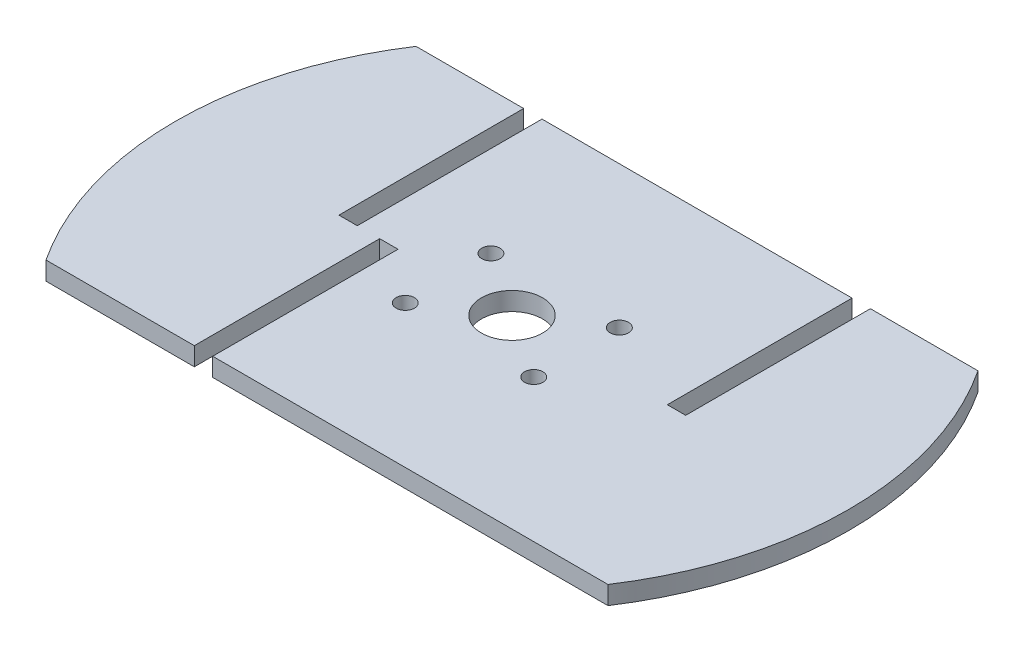
ISO-10303-21;
HEADER;
FILE_DESCRIPTION(('STEP AP214'),'2;1');
FILE_NAME('part.step','',(''),(''),'','','');
FILE_SCHEMA(('AUTOMOTIVE_DESIGN { 1 0 10303 214 1 1 1 1 }'));
ENDSEC;
DATA;
#1=APPLICATION_CONTEXT('core data for automotive mechanical design processes');
#2=APPLICATION_PROTOCOL_DEFINITION('international standard','automotive_design',2000,#1);
#3=PRODUCT_CONTEXT('',#1,'mechanical');
#4=PRODUCT('Part','Part','',(#3));
#5=PRODUCT_RELATED_PRODUCT_CATEGORY('part','',(#4));
#6=PRODUCT_DEFINITION_FORMATION('','',#4);
#7=PRODUCT_DEFINITION_CONTEXT('part definition',#1,'design');
#8=PRODUCT_DEFINITION('design','',#6,#7);
#9=PRODUCT_DEFINITION_SHAPE('','',#8);
#10=(LENGTH_UNIT() NAMED_UNIT(*) SI_UNIT(.MILLI.,.METRE.));
#11=(NAMED_UNIT(*) PLANE_ANGLE_UNIT() SI_UNIT($,.RADIAN.));
#12=(NAMED_UNIT(*) SI_UNIT($,.STERADIAN.) SOLID_ANGLE_UNIT());
#13=UNCERTAINTY_MEASURE_WITH_UNIT(LENGTH_MEASURE(1.E-05),#10,'distance_accuracy_value','');
#14=(GEOMETRIC_REPRESENTATION_CONTEXT(3) GLOBAL_UNCERTAINTY_ASSIGNED_CONTEXT((#13)) GLOBAL_UNIT_ASSIGNED_CONTEXT((#10,
#11,#12)) REPRESENTATION_CONTEXT('',''));
#15=CARTESIAN_POINT('',(0.,0.,0.));
#16=DIRECTION('',(0.,0.,1.));
#17=DIRECTION('',(1.,0.,0.));
#18=AXIS2_PLACEMENT_3D('',#15,#16,#17);
#19=CARTESIAN_POINT('',(54.57763981957,3.,56.7970057737135));
#20=DIRECTION('',(0.,0.,1.));
#21=DIRECTION('',(1.,0.,0.));
#22=AXIS2_PLACEMENT_3D('',#19,#20,#21);
#23=PLANE('',#22);
#24=DIRECTION('',(0.,1.,0.));
#25=VECTOR('',#24,1.);
#26=CARTESIAN_POINT('',(-15.45236018043,0.,56.7970057737135));
#27=LINE('',#26,#25);
#28=CARTESIAN_POINT('',(-15.45236018043,0.,56.7970057737135));
#29=VERTEX_POINT('',#28);
#30=CARTESIAN_POINT('',(-15.45236018043,3.,56.7970057737135));
#31=VERTEX_POINT('',#30);
#32=EDGE_CURVE('E345',#29,#31,#27,.T.);
#33=ORIENTED_EDGE('',*,*,#32,.T.);
#34=DIRECTION('',(-1.,0.,0.));
#35=VECTOR('',#34,1.);
#36=CARTESIAN_POINT('',(54.57763981957,3.,56.7970057737135));
#37=LINE('',#36,#35);
#38=CARTESIAN_POINT('',(-39.7014161737776,3.,56.7970057737135));
#39=VERTEX_POINT('',#38);
#40=EDGE_CURVE('E230',#31,#39,#37,.T.);
#41=ORIENTED_EDGE('',*,*,#40,.T.);
#42=DIRECTION('',(0.,1.,0.));
#43=VECTOR('',#42,1.);
#44=CARTESIAN_POINT('',(-39.7014161737776,0.,56.7970057737135));
#45=LINE('',#44,#43);
#46=CARTESIAN_POINT('',(-39.7014161737776,0.,56.7970057737135));
#47=VERTEX_POINT('',#46);
#48=EDGE_CURVE('E331',#47,#39,#45,.T.);
#49=ORIENTED_EDGE('',*,*,#48,.F.);
#50=DIRECTION('',(-1.,0.,0.));
#51=VECTOR('',#50,1.);
#52=CARTESIAN_POINT('',(54.57763981957,0.,56.7970057737135));
#53=LINE('',#52,#51);
#54=EDGE_CURVE('E190',#29,#47,#53,.T.);
#55=ORIENTED_EDGE('',*,*,#54,.F.);
#56=EDGE_LOOP('',(#33,#41,#49,#55));
#57=FACE_BOUND('',#56,.T.);
#58=ADVANCED_FACE('F45',(#57),#23,.T.);
#59=DIRECTION('',(0.,1.,0.));
#60=VECTOR('',#59,1.);
#61=CARTESIAN_POINT('',(-12.45236018043,0.,56.7970057737135));
#62=LINE('',#61,#60);
#63=CARTESIAN_POINT('',(-12.45236018043,0.,56.7970057737135));
#64=VERTEX_POINT('',#63);
#65=CARTESIAN_POINT('',(-12.45236018043,3.,56.7970057737135));
#66=VERTEX_POINT('',#65);
#67=EDGE_CURVE('E164',#64,#66,#62,.T.);
#68=ORIENTED_EDGE('',*,*,#67,.F.);
#69=CARTESIAN_POINT('',(52.1666958129177,0.,56.7970057737135));
#70=VERTEX_POINT('',#69);
#71=EDGE_CURVE('E176',#70,#64,#53,.T.);
#72=ORIENTED_EDGE('',*,*,#71,.F.);
#73=DIRECTION('',(0.,1.,0.));
#74=VECTOR('',#73,1.);
#75=CARTESIAN_POINT('',(52.1666958129177,0.,56.7970057737135));
#76=LINE('',#75,#74);
#77=CARTESIAN_POINT('',(52.1666958129177,3.,56.7970057737135));
#78=VERTEX_POINT('',#77);
#79=EDGE_CURVE('E338',#70,#78,#76,.T.);
#80=ORIENTED_EDGE('',*,*,#79,.T.);
#81=EDGE_CURVE('E178',#78,#66,#37,.T.);
#82=ORIENTED_EDGE('',*,*,#81,.T.);
#83=EDGE_LOOP('',(#68,#72,#80,#82));
#84=FACE_BOUND('',#83,.T.);
#85=ADVANCED_FACE('F47',(#84),#23,.T.);
#86=CARTESIAN_POINT('',(34.57763981957,3.,-3.70299422628653));
#87=DIRECTION('',(0.,0.,-1.));
#88=DIRECTION('',(-1.,0.,0.));
#89=AXIS2_PLACEMENT_3D('',#86,#87,#88);
#90=PLANE('',#89);
#91=DIRECTION('',(0.,1.,0.));
#92=VECTOR('',#91,1.);
#93=CARTESIAN_POINT('',(52.1666958129177,0.,-3.70299422628653));
#94=LINE('',#93,#92);
#95=CARTESIAN_POINT('',(52.1666958129177,0.,-3.70299422628653));
#96=VERTEX_POINT('',#95);
#97=CARTESIAN_POINT('',(52.1666958129177,3.,-3.70299422628653));
#98=VERTEX_POINT('',#97);
#99=EDGE_CURVE('E342',#96,#98,#94,.T.);
#100=ORIENTED_EDGE('',*,*,#99,.F.);
#101=DIRECTION('',(1.,0.,0.));
#102=VECTOR('',#101,1.);
#103=CARTESIAN_POINT('',(34.57763981957,0.,-3.70299422628653));
#104=LINE('',#103,#102);
#105=CARTESIAN_POINT('',(34.57763981957,0.,-3.70299422628653));
#106=VERTEX_POINT('',#105);
#107=EDGE_CURVE('E228',#106,#96,#104,.T.);
#108=ORIENTED_EDGE('',*,*,#107,.F.);
#109=DIRECTION('',(0.,-1.,0.));
#110=VECTOR('',#109,1.);
#111=CARTESIAN_POINT('',(34.57763981957,3.,-3.70299422628653));
#112=LINE('',#111,#110);
#113=CARTESIAN_POINT('',(34.57763981957,3.,-3.70299422628653));
#114=VERTEX_POINT('',#113);
#115=EDGE_CURVE('E11',#114,#106,#112,.T.);
#116=ORIENTED_EDGE('',*,*,#115,.F.);
#117=DIRECTION('',(1.,0.,0.));
#118=VECTOR('',#117,1.);
#119=CARTESIAN_POINT('',(34.57763981957,3.,-3.70299422628653));
#120=LINE('',#119,#118);
#121=EDGE_CURVE('E198',#114,#98,#120,.T.);
#122=ORIENTED_EDGE('',*,*,#121,.T.);
#123=EDGE_LOOP('',(#100,#108,#116,#122));
#124=FACE_BOUND('',#123,.T.);
#125=ADVANCED_FACE('F415',(#124),#90,.T.);
#126=CARTESIAN_POINT('',(34.57763981957,3.,26.4970057737135));
#127=DIRECTION('',(-1.,0.,0.));
#128=DIRECTION('',(0.,0.,1.));
#129=AXIS2_PLACEMENT_3D('',#126,#127,#128);
#130=PLANE('',#129);
#131=DIRECTION('',(0.,0.,-1.));
#132=VECTOR('',#131,1.);
#133=CARTESIAN_POINT('',(34.57763981957,0.,26.4970057737135));
#134=LINE('',#133,#132);
#135=CARTESIAN_POINT('',(34.57763981957,0.,26.4970057737135));
#136=VERTEX_POINT('',#135);
#137=EDGE_CURVE('E224',#136,#106,#134,.T.);
#138=ORIENTED_EDGE('',*,*,#137,.F.);
#139=DIRECTION('',(0.,-1.,0.));
#140=VECTOR('',#139,1.);
#141=CARTESIAN_POINT('',(34.57763981957,3.,26.4970057737135));
#142=LINE('',#141,#140);
#143=CARTESIAN_POINT('',(34.57763981957,3.,26.4970057737135));
#144=VERTEX_POINT('',#143);
#145=EDGE_CURVE('E55',#144,#136,#142,.T.);
#146=ORIENTED_EDGE('',*,*,#145,.F.);
#147=DIRECTION('',(0.,0.,-1.));
#148=VECTOR('',#147,1.);
#149=CARTESIAN_POINT('',(34.57763981957,3.,26.4970057737135));
#150=LINE('',#149,#148);
#151=EDGE_CURVE('E259',#144,#114,#150,.T.);
#152=ORIENTED_EDGE('',*,*,#151,.T.);
#153=ORIENTED_EDGE('',*,*,#115,.T.);
#154=EDGE_LOOP('',(#138,#146,#152,#153));
#155=FACE_BOUND('',#154,.T.);
#156=ADVANCED_FACE('F413',(#155),#130,.T.);
#157=CARTESIAN_POINT('',(31.57763981957,3.,26.4970057737135));
#158=DIRECTION('',(0.,0.,-1.));
#159=DIRECTION('',(-1.,0.,0.));
#160=AXIS2_PLACEMENT_3D('',#157,#158,#159);
#161=PLANE('',#160);
#162=DIRECTION('',(1.,0.,0.));
#163=VECTOR('',#162,1.);
#164=CARTESIAN_POINT('',(31.57763981957,0.,26.4970057737135));
#165=LINE('',#164,#163);
#166=CARTESIAN_POINT('',(31.57763981957,0.,26.4970057737135));
#167=VERTEX_POINT('',#166);
#168=EDGE_CURVE('E220',#167,#136,#165,.T.);
#169=ORIENTED_EDGE('',*,*,#168,.F.);
#170=DIRECTION('',(0.,-1.,0.));
#171=VECTOR('',#170,1.);
#172=CARTESIAN_POINT('',(31.57763981957,3.,26.4970057737135));
#173=LINE('',#172,#171);
#174=CARTESIAN_POINT('',(31.57763981957,3.,26.4970057737135));
#175=VERTEX_POINT('',#174);
#176=EDGE_CURVE('E234',#175,#167,#173,.T.);
#177=ORIENTED_EDGE('',*,*,#176,.F.);
#178=DIRECTION('',(1.,0.,0.));
#179=VECTOR('',#178,1.);
#180=CARTESIAN_POINT('',(31.57763981957,3.,26.4970057737135));
#181=LINE('',#180,#179);
#182=EDGE_CURVE('E265',#175,#144,#181,.T.);
#183=ORIENTED_EDGE('',*,*,#182,.T.);
#184=ORIENTED_EDGE('',*,*,#145,.T.);
#185=EDGE_LOOP('',(#169,#177,#183,#184));
#186=FACE_BOUND('',#185,.T.);
#187=ADVANCED_FACE('F412',(#186),#161,.T.);
#188=CARTESIAN_POINT('',(31.57763981957,3.,-3.70299422628653));
#189=DIRECTION('',(1.,0.,0.));
#190=DIRECTION('',(0.,0.,-1.));
#191=AXIS2_PLACEMENT_3D('',#188,#189,#190);
#192=PLANE('',#191);
#193=DIRECTION('',(0.,0.,1.));
#194=VECTOR('',#193,1.);
#195=CARTESIAN_POINT('',(31.57763981957,0.,-3.70299422628653));
#196=LINE('',#195,#194);
#197=CARTESIAN_POINT('',(31.57763981957,0.,-3.70299422628653));
#198=VERTEX_POINT('',#197);
#199=EDGE_CURVE('E216',#198,#167,#196,.T.);
#200=ORIENTED_EDGE('',*,*,#199,.F.);
#201=DIRECTION('',(0.,-1.,0.));
#202=VECTOR('',#201,1.);
#203=CARTESIAN_POINT('',(31.57763981957,3.,-3.70299422628653));
#204=LINE('',#203,#202);
#205=CARTESIAN_POINT('',(31.57763981957,3.,-3.70299422628653));
#206=VERTEX_POINT('',#205);
#207=EDGE_CURVE('E237',#206,#198,#204,.T.);
#208=ORIENTED_EDGE('',*,*,#207,.F.);
#209=DIRECTION('',(0.,0.,1.));
#210=VECTOR('',#209,1.);
#211=CARTESIAN_POINT('',(31.57763981957,3.,-3.70299422628653));
#212=LINE('',#211,#210);
#213=EDGE_CURVE('E270',#206,#175,#212,.T.);
#214=ORIENTED_EDGE('',*,*,#213,.T.);
#215=ORIENTED_EDGE('',*,*,#176,.T.);
#216=EDGE_LOOP('',(#200,#208,#214,#215));
#217=FACE_BOUND('',#216,.T.);
#218=ADVANCED_FACE('F408',(#217),#192,.T.);
#219=CARTESIAN_POINT('',(-12.45236018043,3.,-3.70299422628653));
#220=DIRECTION('',(0.,0.,-1.));
#221=DIRECTION('',(-1.,0.,0.));
#222=AXIS2_PLACEMENT_3D('',#219,#220,#221);
#223=PLANE('',#222);
#224=DIRECTION('',(1.,0.,0.));
#225=VECTOR('',#224,1.);
#226=CARTESIAN_POINT('',(-12.45236018043,0.,-3.70299422628653));
#227=LINE('',#226,#225);
#228=CARTESIAN_POINT('',(-19.11236018043,0.,-3.70299422628653));
#229=VERTEX_POINT('',#228);
#230=EDGE_CURVE('E212',#229,#198,#227,.T.);
#231=ORIENTED_EDGE('',*,*,#230,.F.);
#232=DIRECTION('',(0.,-1.,0.));
#233=VECTOR('',#232,1.);
#234=CARTESIAN_POINT('',(-19.11236018043,3.,-3.70299422628653));
#235=LINE('',#234,#233);
#236=CARTESIAN_POINT('',(-19.11236018043,3.,-3.70299422628653));
#237=VERTEX_POINT('',#236);
#238=EDGE_CURVE('E240',#237,#229,#235,.T.);
#239=ORIENTED_EDGE('',*,*,#238,.F.);
#240=DIRECTION('',(1.,0.,0.));
#241=VECTOR('',#240,1.);
#242=CARTESIAN_POINT('',(-19.11236018043,3.,-3.70299422628653));
#243=LINE('',#242,#241);
#244=EDGE_CURVE('E276',#237,#206,#243,.T.);
#245=ORIENTED_EDGE('',*,*,#244,.T.);
#246=ORIENTED_EDGE('',*,*,#207,.T.);
#247=EDGE_LOOP('',(#231,#239,#245,#246));
#248=FACE_BOUND('',#247,.T.);
#249=ADVANCED_FACE('F402',(#248),#223,.T.);
#250=CARTESIAN_POINT('',(-19.11236018043,3.,26.4970057737135));
#251=DIRECTION('',(-1.,0.,0.));
#252=DIRECTION('',(0.,0.,1.));
#253=AXIS2_PLACEMENT_3D('',#250,#251,#252);
#254=PLANE('',#253);
#255=DIRECTION('',(0.,0.,-1.));
#256=VECTOR('',#255,1.);
#257=CARTESIAN_POINT('',(-19.11236018043,0.,26.4970057737135));
#258=LINE('',#257,#256);
#259=CARTESIAN_POINT('',(-19.11236018043,0.,26.4970057737135));
#260=VERTEX_POINT('',#259);
#261=EDGE_CURVE('E208',#260,#229,#258,.T.);
#262=ORIENTED_EDGE('',*,*,#261,.F.);
#263=DIRECTION('',(0.,-1.,0.));
#264=VECTOR('',#263,1.);
#265=CARTESIAN_POINT('',(-19.11236018043,3.,26.4970057737135));
#266=LINE('',#265,#264);
#267=CARTESIAN_POINT('',(-19.11236018043,3.,26.4970057737135));
#268=VERTEX_POINT('',#267);
#269=EDGE_CURVE('E244',#268,#260,#266,.T.);
#270=ORIENTED_EDGE('',*,*,#269,.F.);
#271=DIRECTION('',(0.,0.,-1.));
#272=VECTOR('',#271,1.);
#273=CARTESIAN_POINT('',(-19.11236018043,3.,26.4970057737135));
#274=LINE('',#273,#272);
#275=EDGE_CURVE('E279',#268,#237,#274,.T.);
#276=ORIENTED_EDGE('',*,*,#275,.T.);
#277=ORIENTED_EDGE('',*,*,#238,.T.);
#278=EDGE_LOOP('',(#262,#270,#276,#277));
#279=FACE_BOUND('',#278,.T.);
#280=ADVANCED_FACE('F399',(#279),#254,.T.);
#281=CARTESIAN_POINT('',(-22.11236018043,3.,26.4970057737135));
#282=DIRECTION('',(0.,0.,-1.));
#283=DIRECTION('',(-1.,0.,0.));
#284=AXIS2_PLACEMENT_3D('',#281,#282,#283);
#285=PLANE('',#284);
#286=DIRECTION('',(1.,0.,0.));
#287=VECTOR('',#286,1.);
#288=CARTESIAN_POINT('',(-22.11236018043,0.,26.4970057737135));
#289=LINE('',#288,#287);
#290=CARTESIAN_POINT('',(-22.11236018043,0.,26.4970057737135));
#291=VERTEX_POINT('',#290);
#292=EDGE_CURVE('E204',#291,#260,#289,.T.);
#293=ORIENTED_EDGE('',*,*,#292,.F.);
#294=DIRECTION('',(0.,-1.,0.));
#295=VECTOR('',#294,1.);
#296=CARTESIAN_POINT('',(-22.11236018043,3.,26.4970057737135));
#297=LINE('',#296,#295);
#298=CARTESIAN_POINT('',(-22.11236018043,3.,26.4970057737135));
#299=VERTEX_POINT('',#298);
#300=EDGE_CURVE('E246',#299,#291,#297,.T.);
#301=ORIENTED_EDGE('',*,*,#300,.F.);
#302=DIRECTION('',(1.,0.,0.));
#303=VECTOR('',#302,1.);
#304=CARTESIAN_POINT('',(-22.11236018043,3.,26.4970057737135));
#305=LINE('',#304,#303);
#306=EDGE_CURVE('E283',#299,#268,#305,.T.);
#307=ORIENTED_EDGE('',*,*,#306,.T.);
#308=ORIENTED_EDGE('',*,*,#269,.T.);
#309=EDGE_LOOP('',(#293,#301,#307,#308));
#310=FACE_BOUND('',#309,.T.);
#311=ADVANCED_FACE('F396',(#310),#285,.T.);
#312=CARTESIAN_POINT('',(-22.11236018043,3.,-3.70299422628653));
#313=DIRECTION('',(1.,0.,0.));
#314=DIRECTION('',(0.,0.,-1.));
#315=AXIS2_PLACEMENT_3D('',#312,#313,#314);
#316=PLANE('',#315);
#317=DIRECTION('',(0.,0.,1.));
#318=VECTOR('',#317,1.);
#319=CARTESIAN_POINT('',(-22.11236018043,0.,-3.70299422628653));
#320=LINE('',#319,#318);
#321=CARTESIAN_POINT('',(-22.11236018043,0.,-3.70299422628653));
#322=VERTEX_POINT('',#321);
#323=EDGE_CURVE('E194',#322,#291,#320,.T.);
#324=ORIENTED_EDGE('',*,*,#323,.F.);
#325=DIRECTION('',(0.,-1.,0.));
#326=VECTOR('',#325,1.);
#327=CARTESIAN_POINT('',(-22.11236018043,3.,-3.70299422628653));
#328=LINE('',#327,#326);
#329=CARTESIAN_POINT('',(-22.11236018043,3.,-3.70299422628653));
#330=VERTEX_POINT('',#329);
#331=EDGE_CURVE('E49',#330,#322,#328,.T.);
#332=ORIENTED_EDGE('',*,*,#331,.F.);
#333=DIRECTION('',(0.,0.,1.));
#334=VECTOR('',#333,1.);
#335=CARTESIAN_POINT('',(-22.11236018043,3.,-3.70299422628653));
#336=LINE('',#335,#334);
#337=EDGE_CURVE('E287',#330,#299,#336,.T.);
#338=ORIENTED_EDGE('',*,*,#337,.T.);
#339=ORIENTED_EDGE('',*,*,#300,.T.);
#340=EDGE_LOOP('',(#324,#332,#338,#339));
#341=FACE_BOUND('',#340,.T.);
#342=ADVANCED_FACE('F393',(#341),#316,.T.);
#343=CARTESIAN_POINT('',(-42.11236018043,3.,-3.70299422628653));
#344=DIRECTION('',(0.,0.,-1.));
#345=DIRECTION('',(-1.,0.,0.));
#346=AXIS2_PLACEMENT_3D('',#343,#344,#345);
#347=PLANE('',#346);
#348=DIRECTION('',(0.,1.,0.));
#349=VECTOR('',#348,1.);
#350=CARTESIAN_POINT('',(-39.7014161737776,0.,-3.70299422628653));
#351=LINE('',#350,#349);
#352=CARTESIAN_POINT('',(-39.7014161737776,0.,-3.70299422628653));
#353=VERTEX_POINT('',#352);
#354=CARTESIAN_POINT('',(-39.7014161737776,3.,-3.70299422628653));
#355=VERTEX_POINT('',#354);
#356=EDGE_CURVE('E71',#353,#355,#351,.T.);
#357=ORIENTED_EDGE('',*,*,#356,.T.);
#358=DIRECTION('',(1.,0.,0.));
#359=VECTOR('',#358,1.);
#360=CARTESIAN_POINT('',(-42.11236018043,3.,-3.70299422628653));
#361=LINE('',#360,#359);
#362=EDGE_CURVE('E290',#355,#330,#361,.T.);
#363=ORIENTED_EDGE('',*,*,#362,.T.);
#364=ORIENTED_EDGE('',*,*,#331,.T.);
#365=DIRECTION('',(1.,0.,0.));
#366=VECTOR('',#365,1.);
#367=CARTESIAN_POINT('',(-42.11236018043,0.,-3.70299422628653));
#368=LINE('',#367,#366);
#369=EDGE_CURVE('E189',#353,#322,#368,.T.);
#370=ORIENTED_EDGE('',*,*,#369,.F.);
#371=EDGE_LOOP('',(#357,#363,#364,#370));
#372=FACE_BOUND('',#371,.T.);
#373=ADVANCED_FACE('F392',(#372),#347,.T.);
#374=CARTESIAN_POINT('',(-42.11236018043,3.,46.7970057737135));
#375=DIRECTION('',(0.,-1.,0.));
#376=DIRECTION('',(0.,0.,-1.));
#377=AXIS2_PLACEMENT_3D('',#374,#375,#376);
#378=PLANE('',#377);
#379=CARTESIAN_POINT('',(-4.26736018042996,3.,33.4970057737135));
#380=DIRECTION('',(0.,1.,0.));
#381=DIRECTION('',(0.,0.,1.));
#382=AXIS2_PLACEMENT_3D('',#379,#380,#381);
#383=CIRCLE('',#382,1.5);
#384=CARTESIAN_POINT('',(-4.26736018042996,3.,34.9970057737135));
#385=VERTEX_POINT('',#384);
#386=EDGE_CURVE('E307',#385,#385,#383,.T.);
#387=ORIENTED_EDGE('',*,*,#386,.F.);
#388=EDGE_LOOP('',(#387));
#389=FACE_BOUND('',#388,.T.);
#390=CARTESIAN_POINT('',(16.73263981957,3.,19.4970057737135));
#391=DIRECTION('',(0.,1.,0.));
#392=DIRECTION('',(0.,0.,1.));
#393=AXIS2_PLACEMENT_3D('',#390,#391,#392);
#394=CIRCLE('',#393,1.5);
#395=CARTESIAN_POINT('',(16.73263981957,3.,20.9970057737135));
#396=VERTEX_POINT('',#395);
#397=EDGE_CURVE('E315',#396,#396,#394,.T.);
#398=ORIENTED_EDGE('',*,*,#397,.F.);
#399=EDGE_LOOP('',(#398));
#400=FACE_BOUND('',#399,.T.);
#401=CARTESIAN_POINT('',(16.73263981957,3.,33.4970057737135));
#402=DIRECTION('',(0.,1.,0.));
#403=DIRECTION('',(0.,0.,1.));
#404=AXIS2_PLACEMENT_3D('',#401,#402,#403);
#405=CIRCLE('',#404,1.5);
#406=CARTESIAN_POINT('',(16.73263981957,3.,34.9970057737135));
#407=VERTEX_POINT('',#406);
#408=EDGE_CURVE('E316',#407,#407,#405,.T.);
#409=ORIENTED_EDGE('',*,*,#408,.F.);
#410=EDGE_LOOP('',(#409));
#411=FACE_BOUND('',#410,.T.);
#412=CARTESIAN_POINT('',(-4.26736018042996,3.,19.4970057737135));
#413=DIRECTION('',(0.,1.,0.));
#414=DIRECTION('',(0.,0.,1.));
#415=AXIS2_PLACEMENT_3D('',#412,#413,#414);
#416=CIRCLE('',#415,1.5);
#417=CARTESIAN_POINT('',(-4.26736018042996,3.,20.9970057737135));
#418=VERTEX_POINT('',#417);
#419=EDGE_CURVE('E303',#418,#418,#416,.T.);
#420=ORIENTED_EDGE('',*,*,#419,.F.);
#421=EDGE_LOOP('',(#420));
#422=FACE_BOUND('',#421,.T.);
#423=CARTESIAN_POINT('',(6.23263981957004,3.,26.5470057737135));
#424=DIRECTION('',(0.,1.,0.));
#425=DIRECTION('',(0.,0.,1.));
#426=AXIS2_PLACEMENT_3D('',#423,#424,#425);
#427=CIRCLE('',#426,5.);
#428=CARTESIAN_POINT('',(6.23263981957004,3.,31.5470057737135));
#429=VERTEX_POINT('',#428);
#430=EDGE_CURVE('E295',#429,#429,#427,.T.);
#431=ORIENTED_EDGE('',*,*,#430,.F.);
#432=EDGE_LOOP('',(#431));
#433=FACE_BOUND('',#432,.T.);
#434=ORIENTED_EDGE('',*,*,#40,.F.);
#435=DIRECTION('',(0.,0.,1.));
#436=VECTOR('',#435,1.);
#437=CARTESIAN_POINT('',(-15.45236018043,3.,56.7970057737135));
#438=LINE('',#437,#436);
#439=CARTESIAN_POINT('',(-15.45236018043,3.,26.4970057737135));
#440=VERTEX_POINT('',#439);
#441=EDGE_CURVE('E170',#440,#31,#438,.T.);
#442=ORIENTED_EDGE('',*,*,#441,.F.);
#443=DIRECTION('',(-1.,0.,0.));
#444=VECTOR('',#443,1.);
#445=CARTESIAN_POINT('',(-15.45236018043,3.,26.4970057737135));
#446=LINE('',#445,#444);
#447=CARTESIAN_POINT('',(-12.45236018043,3.,26.4970057737135));
#448=VERTEX_POINT('',#447);
#449=EDGE_CURVE('E368',#448,#440,#446,.T.);
#450=ORIENTED_EDGE('',*,*,#449,.F.);
#451=DIRECTION('',(0.,0.,-1.));
#452=VECTOR('',#451,1.);
#453=CARTESIAN_POINT('',(-12.45236018043,3.,26.4970057737135));
#454=LINE('',#453,#452);
#455=EDGE_CURVE('E372',#66,#448,#454,.T.);
#456=ORIENTED_EDGE('',*,*,#455,.F.);
#457=ORIENTED_EDGE('',*,*,#81,.F.);
#458=CARTESIAN_POINT('',(6.23263981957004,3.,26.5470057737135));
#459=DIRECTION('',(0.,-1.,0.));
#460=DIRECTION('',(0.,0.,-1.));
#461=AXIS2_PLACEMENT_3D('',#458,#459,#460);
#462=CIRCLE('',#461,55.);
#463=EDGE_CURVE('E337',#98,#78,#462,.T.);
#464=ORIENTED_EDGE('',*,*,#463,.F.);
#465=ORIENTED_EDGE('',*,*,#121,.F.);
#466=ORIENTED_EDGE('',*,*,#151,.F.);
#467=ORIENTED_EDGE('',*,*,#182,.F.);
#468=ORIENTED_EDGE('',*,*,#213,.F.);
#469=ORIENTED_EDGE('',*,*,#244,.F.);
#470=ORIENTED_EDGE('',*,*,#275,.F.);
#471=ORIENTED_EDGE('',*,*,#306,.F.);
#472=ORIENTED_EDGE('',*,*,#337,.F.);
#473=ORIENTED_EDGE('',*,*,#362,.F.);
#474=CARTESIAN_POINT('',(6.23263981957004,3.,26.5470057737135));
#475=DIRECTION('',(0.,-1.,0.));
#476=DIRECTION('',(0.,0.,-1.));
#477=AXIS2_PLACEMENT_3D('',#474,#475,#476);
#478=CIRCLE('',#477,55.);
#479=EDGE_CURVE('E341',#39,#355,#478,.T.);
#480=ORIENTED_EDGE('',*,*,#479,.F.);
#481=EDGE_LOOP('',(#434,#442,#450,#456,#457,#464,#465,#466,#467,#468,#469,#470,#471,#472,#473,#480));
#482=FACE_BOUND('',#481,.T.);
#483=ADVANCED_FACE('F388',(#389,#400,#411,#422,#433,#482),#378,.F.);
#484=CARTESIAN_POINT('',(-42.11236018043,0.,46.7970057737135));
#485=DIRECTION('',(0.,-1.,0.));
#486=DIRECTION('',(0.,0.,-1.));
#487=AXIS2_PLACEMENT_3D('',#484,#485,#486);
#488=PLANE('',#487);
#489=DIRECTION('',(0.,0.,1.));
#490=VECTOR('',#489,1.);
#491=CARTESIAN_POINT('',(-15.45236018043,0.,56.7970057737135));
#492=LINE('',#491,#490);
#493=CARTESIAN_POINT('',(-15.45236018043,0.,26.4970057737135));
#494=VERTEX_POINT('',#493);
#495=EDGE_CURVE('E180',#494,#29,#492,.T.);
#496=ORIENTED_EDGE('',*,*,#495,.T.);
#497=ORIENTED_EDGE('',*,*,#54,.T.);
#498=CARTESIAN_POINT('',(6.23263981957004,0.,26.5470057737135));
#499=DIRECTION('',(0.,-1.,0.));
#500=DIRECTION('',(0.,0.,-1.));
#501=AXIS2_PLACEMENT_3D('',#498,#499,#500);
#502=CIRCLE('',#501,55.);
#503=EDGE_CURVE('E350',#47,#353,#502,.T.);
#504=ORIENTED_EDGE('',*,*,#503,.T.);
#505=ORIENTED_EDGE('',*,*,#369,.T.);
#506=ORIENTED_EDGE('',*,*,#323,.T.);
#507=ORIENTED_EDGE('',*,*,#292,.T.);
#508=ORIENTED_EDGE('',*,*,#261,.T.);
#509=ORIENTED_EDGE('',*,*,#230,.T.);
#510=ORIENTED_EDGE('',*,*,#199,.T.);
#511=ORIENTED_EDGE('',*,*,#168,.T.);
#512=ORIENTED_EDGE('',*,*,#137,.T.);
#513=ORIENTED_EDGE('',*,*,#107,.T.);
#514=CARTESIAN_POINT('',(6.23263981957004,0.,26.5470057737135));
#515=DIRECTION('',(0.,-1.,0.));
#516=DIRECTION('',(0.,0.,-1.));
#517=AXIS2_PLACEMENT_3D('',#514,#515,#516);
#518=CIRCLE('',#517,55.);
#519=EDGE_CURVE('E187',#96,#70,#518,.T.);
#520=ORIENTED_EDGE('',*,*,#519,.T.);
#521=ORIENTED_EDGE('',*,*,#71,.T.);
#522=DIRECTION('',(0.,0.,-1.));
#523=VECTOR('',#522,1.);
#524=CARTESIAN_POINT('',(-12.45236018043,0.,26.4970057737135));
#525=LINE('',#524,#523);
#526=CARTESIAN_POINT('',(-12.45236018043,0.,26.4970057737135));
#527=VERTEX_POINT('',#526);
#528=EDGE_CURVE('E160',#64,#527,#525,.T.);
#529=ORIENTED_EDGE('',*,*,#528,.T.);
#530=DIRECTION('',(-1.,0.,0.));
#531=VECTOR('',#530,1.);
#532=CARTESIAN_POINT('',(-15.45236018043,0.,26.4970057737135));
#533=LINE('',#532,#531);
#534=EDGE_CURVE('E63',#527,#494,#533,.T.);
#535=ORIENTED_EDGE('',*,*,#534,.T.);
#536=EDGE_LOOP('',(#496,#497,#504,#505,#506,#507,#508,#509,#510,#511,#512,#513,#520,#521,#529,#535));
#537=FACE_BOUND('',#536,.T.);
#538=CARTESIAN_POINT('',(-4.26736018042996,0.,33.4970057737135));
#539=DIRECTION('',(0.,1.,0.));
#540=DIRECTION('',(0.,0.,1.));
#541=AXIS2_PLACEMENT_3D('',#538,#539,#540);
#542=CIRCLE('',#541,1.5);
#543=CARTESIAN_POINT('',(-4.26736018042996,0.,34.9970057737135));
#544=VERTEX_POINT('',#543);
#545=EDGE_CURVE('E320',#544,#544,#542,.T.);
#546=ORIENTED_EDGE('',*,*,#545,.T.);
#547=EDGE_LOOP('',(#546));
#548=FACE_BOUND('',#547,.T.);
#549=CARTESIAN_POINT('',(16.73263981957,0.,19.4970057737135));
#550=DIRECTION('',(0.,1.,0.));
#551=DIRECTION('',(0.,0.,1.));
#552=AXIS2_PLACEMENT_3D('',#549,#550,#551);
#553=CIRCLE('',#552,1.5);
#554=CARTESIAN_POINT('',(16.73263981957,0.,20.9970057737135));
#555=VERTEX_POINT('',#554);
#556=EDGE_CURVE('E311',#555,#555,#553,.T.);
#557=ORIENTED_EDGE('',*,*,#556,.T.);
#558=EDGE_LOOP('',(#557));
#559=FACE_BOUND('',#558,.T.);
#560=CARTESIAN_POINT('',(16.73263981957,0.,33.4970057737135));
#561=DIRECTION('',(0.,1.,0.));
#562=DIRECTION('',(0.,0.,1.));
#563=AXIS2_PLACEMENT_3D('',#560,#561,#562);
#564=CIRCLE('',#563,1.5);
#565=CARTESIAN_POINT('',(16.73263981957,0.,34.9970057737135));
#566=VERTEX_POINT('',#565);
#567=EDGE_CURVE('E327',#566,#566,#564,.T.);
#568=ORIENTED_EDGE('',*,*,#567,.T.);
#569=EDGE_LOOP('',(#568));
#570=FACE_BOUND('',#569,.T.);
#571=CARTESIAN_POINT('',(-4.26736018042996,0.,19.4970057737135));
#572=DIRECTION('',(0.,1.,0.));
#573=DIRECTION('',(0.,0.,1.));
#574=AXIS2_PLACEMENT_3D('',#571,#572,#573);
#575=CIRCLE('',#574,1.5);
#576=CARTESIAN_POINT('',(-4.26736018042996,0.,20.9970057737135));
#577=VERTEX_POINT('',#576);
#578=EDGE_CURVE('E299',#577,#577,#575,.T.);
#579=ORIENTED_EDGE('',*,*,#578,.T.);
#580=EDGE_LOOP('',(#579));
#581=FACE_BOUND('',#580,.T.);
#582=CARTESIAN_POINT('',(6.23263981957004,0.,26.5470057737135));
#583=DIRECTION('',(0.,1.,0.));
#584=DIRECTION('',(0.,0.,1.));
#585=AXIS2_PLACEMENT_3D('',#582,#583,#584);
#586=CIRCLE('',#585,5.);
#587=CARTESIAN_POINT('',(6.23263981957004,0.,31.5470057737135));
#588=VERTEX_POINT('',#587);
#589=EDGE_CURVE('E196',#588,#588,#586,.T.);
#590=ORIENTED_EDGE('',*,*,#589,.T.);
#591=EDGE_LOOP('',(#590));
#592=FACE_BOUND('',#591,.T.);
#593=ADVANCED_FACE('F184',(#537,#548,#559,#570,#581,#592),#488,.T.);
#594=CARTESIAN_POINT('',(6.23263981957004,0.,26.5470057737135));
#595=DIRECTION('',(0.,1.,0.));
#596=DIRECTION('',(0.,0.,1.));
#597=AXIS2_PLACEMENT_3D('',#594,#595,#596);
#598=CYLINDRICAL_SURFACE('',#597,5.);
#599=ORIENTED_EDGE('',*,*,#589,.F.);
#600=EDGE_LOOP('',(#599));
#601=FACE_BOUND('',#600,.T.);
#602=ORIENTED_EDGE('',*,*,#430,.T.);
#603=EDGE_LOOP('',(#602));
#604=FACE_BOUND('',#603,.T.);
#605=ADVANCED_FACE('F466',(#601,#604),#598,.F.);
#606=CARTESIAN_POINT('',(-4.26736018042996,0.,19.4970057737135));
#607=DIRECTION('',(0.,1.,0.));
#608=DIRECTION('',(0.,0.,1.));
#609=AXIS2_PLACEMENT_3D('',#606,#607,#608);
#610=CYLINDRICAL_SURFACE('',#609,1.5);
#611=ORIENTED_EDGE('',*,*,#578,.F.);
#612=EDGE_LOOP('',(#611));
#613=FACE_BOUND('',#612,.T.);
#614=ORIENTED_EDGE('',*,*,#419,.T.);
#615=EDGE_LOOP('',(#614));
#616=FACE_BOUND('',#615,.T.);
#617=ADVANCED_FACE('F472',(#613,#616),#610,.F.);
#618=CARTESIAN_POINT('',(16.73263981957,0.,33.4970057737135));
#619=DIRECTION('',(0.,1.,0.));
#620=DIRECTION('',(0.,0.,1.));
#621=AXIS2_PLACEMENT_3D('',#618,#619,#620);
#622=CYLINDRICAL_SURFACE('',#621,1.5);
#623=ORIENTED_EDGE('',*,*,#567,.F.);
#624=EDGE_LOOP('',(#623));
#625=FACE_BOUND('',#624,.T.);
#626=ORIENTED_EDGE('',*,*,#408,.T.);
#627=EDGE_LOOP('',(#626));
#628=FACE_BOUND('',#627,.T.);
#629=ADVANCED_FACE('F476',(#625,#628),#622,.F.);
#630=CARTESIAN_POINT('',(16.73263981957,0.,19.4970057737135));
#631=DIRECTION('',(0.,1.,0.));
#632=DIRECTION('',(0.,0.,1.));
#633=AXIS2_PLACEMENT_3D('',#630,#631,#632);
#634=CYLINDRICAL_SURFACE('',#633,1.5);
#635=ORIENTED_EDGE('',*,*,#556,.F.);
#636=EDGE_LOOP('',(#635));
#637=FACE_BOUND('',#636,.T.);
#638=ORIENTED_EDGE('',*,*,#397,.T.);
#639=EDGE_LOOP('',(#638));
#640=FACE_BOUND('',#639,.T.);
#641=ADVANCED_FACE('F478',(#637,#640),#634,.F.);
#642=CARTESIAN_POINT('',(-4.26736018042996,0.,33.4970057737135));
#643=DIRECTION('',(0.,1.,0.));
#644=DIRECTION('',(0.,0.,1.));
#645=AXIS2_PLACEMENT_3D('',#642,#643,#644);
#646=CYLINDRICAL_SURFACE('',#645,1.5);
#647=ORIENTED_EDGE('',*,*,#545,.F.);
#648=EDGE_LOOP('',(#647));
#649=FACE_BOUND('',#648,.T.);
#650=ORIENTED_EDGE('',*,*,#386,.T.);
#651=EDGE_LOOP('',(#650));
#652=FACE_BOUND('',#651,.T.);
#653=ADVANCED_FACE('F481',(#649,#652),#646,.F.);
#654=CARTESIAN_POINT('',(6.23263981957004,0.,26.5470057737135));
#655=DIRECTION('',(0.,1.,0.));
#656=DIRECTION('',(0.,0.,1.));
#657=AXIS2_PLACEMENT_3D('',#654,#655,#656);
#658=CYLINDRICAL_SURFACE('',#657,55.);
#659=ORIENTED_EDGE('',*,*,#463,.T.);
#660=ORIENTED_EDGE('',*,*,#79,.F.);
#661=ORIENTED_EDGE('',*,*,#519,.F.);
#662=ORIENTED_EDGE('',*,*,#99,.T.);
#663=EDGE_LOOP('',(#659,#660,#661,#662));
#664=FACE_BOUND('',#663,.T.);
#665=ADVANCED_FACE('F418',(#664),#658,.T.);
#666=CARTESIAN_POINT('',(6.23263981957004,0.,26.5470057737135));
#667=DIRECTION('',(0.,1.,0.));
#668=DIRECTION('',(0.,0.,1.));
#669=AXIS2_PLACEMENT_3D('',#666,#667,#668);
#670=CYLINDRICAL_SURFACE('',#669,55.);
#671=ORIENTED_EDGE('',*,*,#479,.T.);
#672=ORIENTED_EDGE('',*,*,#356,.F.);
#673=ORIENTED_EDGE('',*,*,#503,.F.);
#674=ORIENTED_EDGE('',*,*,#48,.T.);
#675=EDGE_LOOP('',(#671,#672,#673,#674));
#676=FACE_BOUND('',#675,.T.);
#677=ADVANCED_FACE('F385',(#676),#670,.T.);
#678=CARTESIAN_POINT('',(-15.45236018043,0.,56.7970057737135));
#679=DIRECTION('',(-1.,0.,0.));
#680=DIRECTION('',(0.,0.,1.));
#681=AXIS2_PLACEMENT_3D('',#678,#679,#680);
#682=PLANE('',#681);
#683=ORIENTED_EDGE('',*,*,#441,.T.);
#684=ORIENTED_EDGE('',*,*,#32,.F.);
#685=ORIENTED_EDGE('',*,*,#495,.F.);
#686=DIRECTION('',(0.,1.,0.));
#687=VECTOR('',#686,1.);
#688=CARTESIAN_POINT('',(-15.45236018043,0.,26.4970057737135));
#689=LINE('',#688,#687);
#690=EDGE_CURVE('E360',#494,#440,#689,.T.);
#691=ORIENTED_EDGE('',*,*,#690,.T.);
#692=EDGE_LOOP('',(#683,#684,#685,#691));
#693=FACE_BOUND('',#692,.T.);
#694=ADVANCED_FACE('F421',(#693),#682,.F.);
#695=CARTESIAN_POINT('',(-15.45236018043,0.,26.4970057737135));
#696=DIRECTION('',(0.,0.,-1.));
#697=DIRECTION('',(-1.,0.,0.));
#698=AXIS2_PLACEMENT_3D('',#695,#696,#697);
#699=PLANE('',#698);
#700=ORIENTED_EDGE('',*,*,#449,.T.);
#701=ORIENTED_EDGE('',*,*,#690,.F.);
#702=ORIENTED_EDGE('',*,*,#534,.F.);
#703=DIRECTION('',(0.,1.,0.));
#704=VECTOR('',#703,1.);
#705=CARTESIAN_POINT('',(-12.45236018043,0.,26.4970057737135));
#706=LINE('',#705,#704);
#707=EDGE_CURVE('E166',#527,#448,#706,.T.);
#708=ORIENTED_EDGE('',*,*,#707,.T.);
#709=EDGE_LOOP('',(#700,#701,#702,#708));
#710=FACE_BOUND('',#709,.T.);
#711=ADVANCED_FACE('F420',(#710),#699,.F.);
#712=CARTESIAN_POINT('',(-12.45236018043,0.,26.4970057737135));
#713=DIRECTION('',(1.,0.,0.));
#714=DIRECTION('',(0.,0.,-1.));
#715=AXIS2_PLACEMENT_3D('',#712,#713,#714);
#716=PLANE('',#715);
#717=ORIENTED_EDGE('',*,*,#455,.T.);
#718=ORIENTED_EDGE('',*,*,#707,.F.);
#719=ORIENTED_EDGE('',*,*,#528,.F.);
#720=ORIENTED_EDGE('',*,*,#67,.T.);
#721=EDGE_LOOP('',(#717,#718,#719,#720));
#722=FACE_BOUND('',#721,.T.);
#723=ADVANCED_FACE('F163',(#722),#716,.F.);
#724=CLOSED_SHELL('',(#58,#85,#125,#156,#187,#218,#249,#280,#311,#342,#373,#483,#593,#605,#617,
#629,#641,#653,#665,#677,#694,#711,#723));
#725=MANIFOLD_SOLID_BREP('B2',#724);
#726=ADVANCED_BREP_SHAPE_REPRESENTATION('',(#18,#725),#14);
#727=SHAPE_DEFINITION_REPRESENTATION(#9,#726);
ENDSEC;
END-ISO-10303-21;
